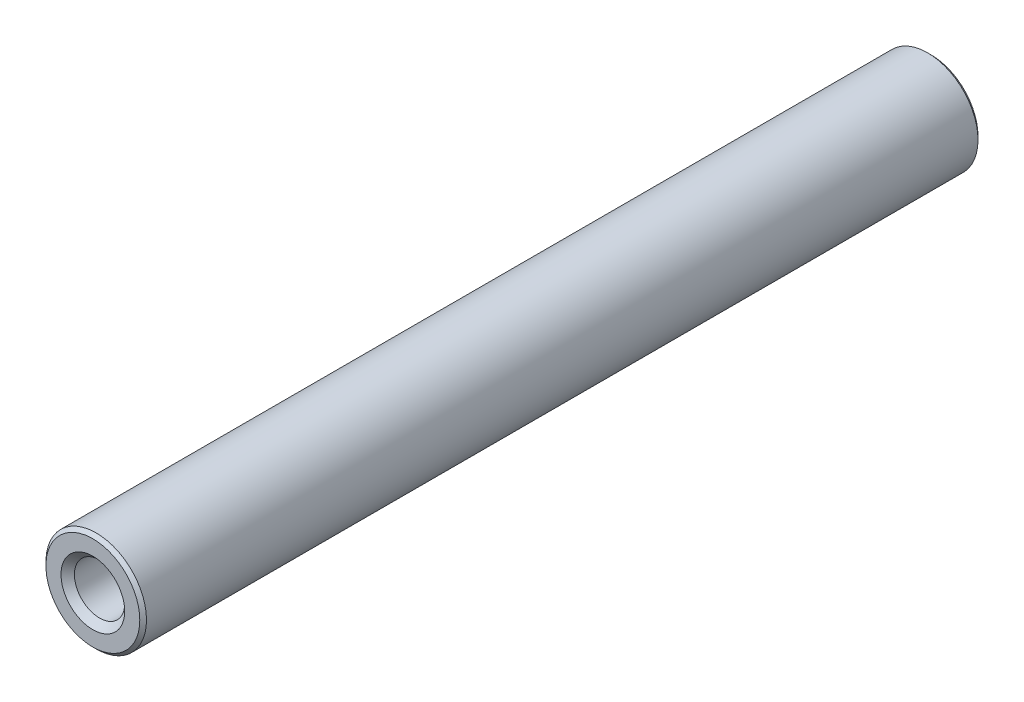
ISO-10303-21;
HEADER;
FILE_DESCRIPTION(('STEP AP214'),'2;1');
FILE_NAME('part.step','',(''),(''),'','','');
FILE_SCHEMA(('AUTOMOTIVE_DESIGN { 1 0 10303 214 1 1 1 1 }'));
ENDSEC;
DATA;
#1=APPLICATION_CONTEXT('core data for automotive mechanical design processes');
#2=APPLICATION_PROTOCOL_DEFINITION('international standard','automotive_design',2000,#1);
#3=PRODUCT_CONTEXT('',#1,'mechanical');
#4=PRODUCT('Part','Part','',(#3));
#5=PRODUCT_RELATED_PRODUCT_CATEGORY('part','',(#4));
#6=PRODUCT_DEFINITION_FORMATION('','',#4);
#7=PRODUCT_DEFINITION_CONTEXT('part definition',#1,'design');
#8=PRODUCT_DEFINITION('design','',#6,#7);
#9=PRODUCT_DEFINITION_SHAPE('','',#8);
#10=(LENGTH_UNIT() NAMED_UNIT(*) SI_UNIT(.MILLI.,.METRE.));
#11=(NAMED_UNIT(*) PLANE_ANGLE_UNIT() SI_UNIT($,.RADIAN.));
#12=(NAMED_UNIT(*) SI_UNIT($,.STERADIAN.) SOLID_ANGLE_UNIT());
#13=UNCERTAINTY_MEASURE_WITH_UNIT(LENGTH_MEASURE(1.E-05),#10,'distance_accuracy_value','');
#14=(GEOMETRIC_REPRESENTATION_CONTEXT(3) GLOBAL_UNCERTAINTY_ASSIGNED_CONTEXT((#13)) GLOBAL_UNIT_ASSIGNED_CONTEXT((#10,
#11,#12)) REPRESENTATION_CONTEXT('',''));
#15=CARTESIAN_POINT('',(0.,0.,0.));
#16=DIRECTION('',(0.,0.,1.));
#17=DIRECTION('',(1.,0.,0.));
#18=AXIS2_PLACEMENT_3D('',#15,#16,#17);
#19=CARTESIAN_POINT('',(0.,0.,-25.0030516408341));
#20=DIRECTION('',(0.,0.,1.));
#21=DIRECTION('',(1.,0.,0.));
#22=AXIS2_PLACEMENT_3D('',#19,#20,#21);
#23=CYLINDRICAL_SURFACE('',#22,1.5);
#24=CARTESIAN_POINT('',(0.,0.,-17.));
#25=DIRECTION('',(0.,0.,1.));
#26=DIRECTION('',(1.,0.,0.));
#27=AXIS2_PLACEMENT_3D('',#24,#25,#26);
#28=CIRCLE('',#27,1.5);
#29=CARTESIAN_POINT('',(1.5,0.,-17.));
#30=VERTEX_POINT('',#29);
#31=EDGE_CURVE('E79',#30,#30,#28,.T.);
#32=ORIENTED_EDGE('',*,*,#31,.T.);
#33=EDGE_LOOP('',(#32));
#34=FACE_BOUND('',#33,.T.);
#35=CARTESIAN_POINT('',(0.,0.,-24.6000592728107));
#36=DIRECTION('',(0.,0.,1.));
#37=DIRECTION('',(1.,0.,0.));
#38=AXIS2_PLACEMENT_3D('',#35,#36,#37);
#39=CIRCLE('',#38,1.5);
#40=CARTESIAN_POINT('',(1.5,0.,-24.6000592728107));
#41=VERTEX_POINT('',#40);
#42=EDGE_CURVE('E10',#41,#41,#39,.T.);
#43=ORIENTED_EDGE('',*,*,#42,.F.);
#44=EDGE_LOOP('',(#43));
#45=FACE_BOUND('',#44,.T.);
#46=ADVANCED_FACE('F36',(#34,#45),#23,.F.);
#47=CARTESIAN_POINT('',(0.,0.,-25.));
#48=DIRECTION('',(0.,0.,-1.));
#49=DIRECTION('',(-1.,0.,0.));
#50=AXIS2_PLACEMENT_3D('',#47,#48,#49);
#51=CONICAL_SURFACE('',#50,1.89992492404044,0.785378406143489);
#52=ORIENTED_EDGE('',*,*,#42,.T.);
#53=EDGE_LOOP('',(#52));
#54=FACE_BOUND('',#53,.T.);
#55=CARTESIAN_POINT('',(0.,0.,-25.));
#56=DIRECTION('',(0.,0.,1.));
#57=DIRECTION('',(1.,0.,0.));
#58=AXIS2_PLACEMENT_3D('',#55,#56,#57);
#59=CIRCLE('',#58,1.89992492404044);
#60=CARTESIAN_POINT('',(1.89992492404044,0.,-25.));
#61=VERTEX_POINT('',#60);
#62=EDGE_CURVE('E43',#61,#61,#59,.T.);
#63=ORIENTED_EDGE('',*,*,#62,.F.);
#64=EDGE_LOOP('',(#63));
#65=FACE_BOUND('',#64,.T.);
#66=ADVANCED_FACE('F97',(#54,#65),#51,.F.);
#67=CARTESIAN_POINT('',(2.79996108933619,0.,-25.));
#68=DIRECTION('',(0.,0.,-1.));
#69=DIRECTION('',(-1.,0.,0.));
#70=AXIS2_PLACEMENT_3D('',#67,#68,#69);
#71=PLANE('',#70);
#72=ORIENTED_EDGE('',*,*,#62,.T.);
#73=EDGE_LOOP('',(#72));
#74=FACE_BOUND('',#73,.T.);
#75=CARTESIAN_POINT('',(0.,0.,-25.));
#76=DIRECTION('',(0.,0.,1.));
#77=DIRECTION('',(1.,0.,0.));
#78=AXIS2_PLACEMENT_3D('',#75,#76,#77);
#79=CIRCLE('',#78,2.79996108933619);
#80=CARTESIAN_POINT('',(2.79996108933619,0.,-25.));
#81=VERTEX_POINT('',#80);
#82=EDGE_CURVE('E50',#81,#81,#79,.T.);
#83=ORIENTED_EDGE('',*,*,#82,.F.);
#84=EDGE_LOOP('',(#83));
#85=FACE_BOUND('',#84,.T.);
#86=ADVANCED_FACE('F101',(#74,#85),#71,.T.);
#87=CARTESIAN_POINT('',(0.,0.,-24.7999582440572));
#88=DIRECTION('',(0.,0.,1.));
#89=DIRECTION('',(1.,0.,0.));
#90=AXIS2_PLACEMENT_3D('',#87,#88,#89);
#91=CONICAL_SURFACE('',#90,3.,0.785391051634068);
#92=ORIENTED_EDGE('',*,*,#82,.T.);
#93=EDGE_LOOP('',(#92));
#94=FACE_BOUND('',#93,.T.);
#95=CARTESIAN_POINT('',(0.,0.,-24.7999582440572));
#96=DIRECTION('',(0.,0.,1.));
#97=DIRECTION('',(1.,0.,0.));
#98=AXIS2_PLACEMENT_3D('',#95,#96,#97);
#99=CIRCLE('',#98,3.);
#100=CARTESIAN_POINT('',(3.,0.,-24.7999582440572));
#101=VERTEX_POINT('',#100);
#102=EDGE_CURVE('E56',#101,#101,#99,.T.);
#103=ORIENTED_EDGE('',*,*,#102,.F.);
#104=EDGE_LOOP('',(#103));
#105=FACE_BOUND('',#104,.T.);
#106=ADVANCED_FACE('F105',(#94,#105),#91,.T.);
#107=CARTESIAN_POINT('',(0.,0.,-25.0030516408341));
#108=DIRECTION('',(0.,0.,1.));
#109=DIRECTION('',(1.,0.,0.));
#110=AXIS2_PLACEMENT_3D('',#107,#108,#109);
#111=CYLINDRICAL_SURFACE('',#110,3.);
#112=ORIENTED_EDGE('',*,*,#102,.T.);
#113=EDGE_LOOP('',(#112));
#114=FACE_BOUND('',#113,.T.);
#115=CARTESIAN_POINT('',(0.,0.,24.7999245050787));
#116=DIRECTION('',(0.,0.,1.));
#117=DIRECTION('',(1.,0.,0.));
#118=AXIS2_PLACEMENT_3D('',#115,#116,#117);
#119=CIRCLE('',#118,3.);
#120=CARTESIAN_POINT('',(3.,0.,24.7999245050787));
#121=VERTEX_POINT('',#120);
#122=EDGE_CURVE('E62',#121,#121,#119,.T.);
#123=ORIENTED_EDGE('',*,*,#122,.F.);
#124=EDGE_LOOP('',(#123));
#125=FACE_BOUND('',#124,.T.);
#126=ADVANCED_FACE('F111',(#114,#125),#111,.T.);
#127=CARTESIAN_POINT('',(0.,0.,25.));
#128=DIRECTION('',(0.,0.,-1.));
#129=DIRECTION('',(-1.,0.,0.));
#130=AXIS2_PLACEMENT_3D('',#127,#128,#129);
#131=CONICAL_SURFACE('',#130,2.79992953986533,0.785385581022011);
#132=ORIENTED_EDGE('',*,*,#122,.T.);
#133=EDGE_LOOP('',(#132));
#134=FACE_BOUND('',#133,.T.);
#135=CARTESIAN_POINT('',(0.,0.,25.));
#136=DIRECTION('',(0.,0.,1.));
#137=DIRECTION('',(1.,0.,0.));
#138=AXIS2_PLACEMENT_3D('',#135,#136,#137);
#139=CIRCLE('',#138,2.79992953986533);
#140=CARTESIAN_POINT('',(2.79992953986533,0.,25.));
#141=VERTEX_POINT('',#140);
#142=EDGE_CURVE('E65',#141,#141,#139,.T.);
#143=ORIENTED_EDGE('',*,*,#142,.F.);
#144=EDGE_LOOP('',(#143));
#145=FACE_BOUND('',#144,.T.);
#146=ADVANCED_FACE('F115',(#134,#145),#131,.T.);
#147=CARTESIAN_POINT('',(1.89992492404044,0.,25.));
#148=DIRECTION('',(0.,0.,1.));
#149=DIRECTION('',(1.,0.,0.));
#150=AXIS2_PLACEMENT_3D('',#147,#148,#149);
#151=PLANE('',#150);
#152=ORIENTED_EDGE('',*,*,#142,.T.);
#153=EDGE_LOOP('',(#152));
#154=FACE_BOUND('',#153,.T.);
#155=CARTESIAN_POINT('',(0.,0.,25.));
#156=DIRECTION('',(0.,0.,1.));
#157=DIRECTION('',(1.,0.,0.));
#158=AXIS2_PLACEMENT_3D('',#155,#156,#157);
#159=CIRCLE('',#158,1.89992492404044);
#160=CARTESIAN_POINT('',(1.89992492404044,0.,25.));
#161=VERTEX_POINT('',#160);
#162=EDGE_CURVE('E69',#161,#161,#159,.T.);
#163=ORIENTED_EDGE('',*,*,#162,.F.);
#164=EDGE_LOOP('',(#163));
#165=FACE_BOUND('',#164,.T.);
#166=ADVANCED_FACE('F119',(#154,#165),#151,.T.);
#167=CARTESIAN_POINT('',(0.,0.,24.6000592728107));
#168=DIRECTION('',(0.,0.,1.));
#169=DIRECTION('',(1.,0.,0.));
#170=AXIS2_PLACEMENT_3D('',#167,#168,#169);
#171=CONICAL_SURFACE('',#170,1.5,0.785378406143483);
#172=ORIENTED_EDGE('',*,*,#162,.T.);
#173=EDGE_LOOP('',(#172));
#174=FACE_BOUND('',#173,.T.);
#175=CARTESIAN_POINT('',(0.,0.,24.6000592728107));
#176=DIRECTION('',(0.,0.,1.));
#177=DIRECTION('',(1.,0.,0.));
#178=AXIS2_PLACEMENT_3D('',#175,#176,#177);
#179=CIRCLE('',#178,1.5);
#180=CARTESIAN_POINT('',(1.5,0.,24.6000592728107));
#181=VERTEX_POINT('',#180);
#182=EDGE_CURVE('E72',#181,#181,#179,.T.);
#183=ORIENTED_EDGE('',*,*,#182,.F.);
#184=EDGE_LOOP('',(#183));
#185=FACE_BOUND('',#184,.T.);
#186=ADVANCED_FACE('F123',(#174,#185),#171,.F.);
#187=CARTESIAN_POINT('',(0.,0.,-25.0030516408341));
#188=DIRECTION('',(0.,0.,1.));
#189=DIRECTION('',(1.,0.,0.));
#190=AXIS2_PLACEMENT_3D('',#187,#188,#189);
#191=CYLINDRICAL_SURFACE('',#190,1.5);
#192=ORIENTED_EDGE('',*,*,#182,.T.);
#193=EDGE_LOOP('',(#192));
#194=FACE_BOUND('',#193,.T.);
#195=CARTESIAN_POINT('',(0.,0.,17.));
#196=DIRECTION('',(0.,0.,1.));
#197=DIRECTION('',(1.,0.,0.));
#198=AXIS2_PLACEMENT_3D('',#195,#196,#197);
#199=CIRCLE('',#198,1.5);
#200=CARTESIAN_POINT('',(1.5,0.,17.));
#201=VERTEX_POINT('',#200);
#202=EDGE_CURVE('E76',#201,#201,#199,.T.);
#203=ORIENTED_EDGE('',*,*,#202,.F.);
#204=EDGE_LOOP('',(#203));
#205=FACE_BOUND('',#204,.T.);
#206=ADVANCED_FACE('F93',(#194,#205),#191,.F.);
#207=CARTESIAN_POINT('',(0.,0.,17.));
#208=DIRECTION('',(0.,0.,1.));
#209=DIRECTION('',(1.,0.,0.));
#210=AXIS2_PLACEMENT_3D('',#207,#208,#209);
#211=PLANE('',#210);
#212=ORIENTED_EDGE('',*,*,#202,.T.);
#213=EDGE_LOOP('',(#212));
#214=FACE_BOUND('',#213,.T.);
#215=ADVANCED_FACE('F88',(#214),#211,.T.);
#216=CARTESIAN_POINT('',(1.5,0.,-17.));
#217=DIRECTION('',(0.,0.,-1.));
#218=DIRECTION('',(-1.,0.,0.));
#219=AXIS2_PLACEMENT_3D('',#216,#217,#218);
#220=PLANE('',#219);
#221=ORIENTED_EDGE('',*,*,#31,.F.);
#222=EDGE_LOOP('',(#221));
#223=FACE_BOUND('',#222,.T.);
#224=ADVANCED_FACE('F86',(#223),#220,.T.);
#225=CLOSED_SHELL('',(#46,#66,#86,#106,#126,#146,#166,#186,#206,#215,#224));
#226=MANIFOLD_SOLID_BREP('B2',#225);
#227=ADVANCED_BREP_SHAPE_REPRESENTATION('',(#18,#226),#14);
#228=SHAPE_DEFINITION_REPRESENTATION(#9,#227);
ENDSEC;
END-ISO-10303-21;
